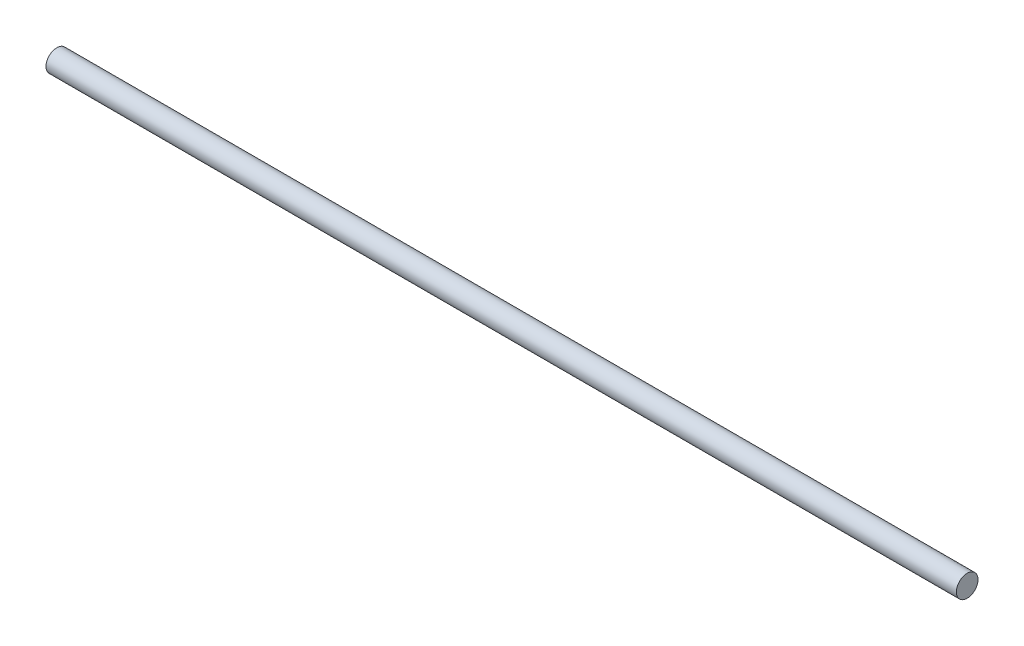
ISO-10303-21;
HEADER;
FILE_DESCRIPTION(('STEP AP214'),'2;1');
FILE_NAME('part.step','',(''),(''),'','','');
FILE_SCHEMA(('AUTOMOTIVE_DESIGN { 1 0 10303 214 1 1 1 1 }'));
ENDSEC;
DATA;
#1=APPLICATION_CONTEXT('core data for automotive mechanical design processes');
#2=APPLICATION_PROTOCOL_DEFINITION('international standard','automotive_design',2000,#1);
#3=PRODUCT_CONTEXT('',#1,'mechanical');
#4=PRODUCT('Part','Part','',(#3));
#5=PRODUCT_RELATED_PRODUCT_CATEGORY('part','',(#4));
#6=PRODUCT_DEFINITION_FORMATION('','',#4);
#7=PRODUCT_DEFINITION_CONTEXT('part definition',#1,'design');
#8=PRODUCT_DEFINITION('design','',#6,#7);
#9=PRODUCT_DEFINITION_SHAPE('','',#8);
#10=(LENGTH_UNIT() NAMED_UNIT(*) SI_UNIT(.MILLI.,.METRE.));
#11=(NAMED_UNIT(*) PLANE_ANGLE_UNIT() SI_UNIT($,.RADIAN.));
#12=(NAMED_UNIT(*) SI_UNIT($,.STERADIAN.) SOLID_ANGLE_UNIT());
#13=UNCERTAINTY_MEASURE_WITH_UNIT(LENGTH_MEASURE(1.E-05),#10,'distance_accuracy_value','');
#14=(GEOMETRIC_REPRESENTATION_CONTEXT(3) GLOBAL_UNCERTAINTY_ASSIGNED_CONTEXT((#13)) GLOBAL_UNIT_ASSIGNED_CONTEXT((#10,
#11,#12)) REPRESENTATION_CONTEXT('',''));
#15=CARTESIAN_POINT('',(0.,0.,0.));
#16=DIRECTION('',(0.,0.,1.));
#17=DIRECTION('',(1.,0.,0.));
#18=AXIS2_PLACEMENT_3D('',#15,#16,#17);
#19=CARTESIAN_POINT('',(191.750877523035,0.,0.));
#20=DIRECTION('',(-1.,0.,0.));
#21=DIRECTION('',(0.,0.,1.));
#22=AXIS2_PLACEMENT_3D('',#19,#20,#21);
#23=CYLINDRICAL_SURFACE('',#22,2.28600000000001);
#24=CARTESIAN_POINT('',(191.750877523035,0.,0.));
#25=DIRECTION('',(1.,0.,0.));
#26=DIRECTION('',(0.,0.,-1.));
#27=AXIS2_PLACEMENT_3D('',#24,#25,#26);
#28=CIRCLE('',#27,2.28600000000001);
#29=CARTESIAN_POINT('',(191.750877523035,0.,2.28600000000001));
#30=VERTEX_POINT('',#29);
#31=EDGE_CURVE('E10',#30,#30,#28,.T.);
#32=CARTESIAN_POINT('',(0.,0.,0.));
#33=DIRECTION('',(1.,0.,0.));
#34=DIRECTION('',(0.,0.,-1.));
#35=AXIS2_PLACEMENT_3D('',#32,#33,#34);
#36=CIRCLE('',#35,2.28600000000001);
#37=CARTESIAN_POINT('',(0.,0.,2.28600000000001));
#38=VERTEX_POINT('',#37);
#39=EDGE_CURVE('E46',#38,#38,#36,.T.);
#40=CARTESIAN_POINT('',(191.750877523035,0.,2.28600000000001));
#41=CARTESIAN_POINT('',(189.753472548837,0.,2.28600000000001));
#42=CARTESIAN_POINT('',(187.756067574638,0.,2.28600000000001));
#43=CARTESIAN_POINT('',(183.761257626242,0.,2.28600000000001));
#44=CARTESIAN_POINT('',(181.763852652043,0.,2.28600000000001));
#45=CARTESIAN_POINT('',(177.769042703647,0.,2.28600000000001));
#46=CARTESIAN_POINT('',(175.771637729449,0.,2.28600000000001));
#47=CARTESIAN_POINT('',(171.776827781052,0.,2.28600000000001));
#48=CARTESIAN_POINT('',(169.779422806854,0.,2.28600000000001));
#49=CARTESIAN_POINT('',(165.784612858457,0.,2.28600000000001));
#50=CARTESIAN_POINT('',(163.787207884259,0.,2.28600000000001));
#51=CARTESIAN_POINT('',(159.792397935862,0.,2.28600000000001));
#52=CARTESIAN_POINT('',(157.794992961664,0.,2.28600000000001));
#53=CARTESIAN_POINT('',(153.800183013268,0.,2.28600000000001));
#54=CARTESIAN_POINT('',(151.802778039069,0.,2.28600000000001));
#55=CARTESIAN_POINT('',(147.807968090673,0.,2.28600000000001));
#56=CARTESIAN_POINT('',(145.810563116474,0.,2.28600000000001));
#57=CARTESIAN_POINT('',(141.815753168078,0.,2.28600000000001));
#58=CARTESIAN_POINT('',(139.81834819388,0.,2.28600000000001));
#59=CARTESIAN_POINT('',(135.823538245483,0.,2.28600000000001));
#60=CARTESIAN_POINT('',(133.826133271285,0.,2.28600000000001));
#61=CARTESIAN_POINT('',(129.831323322888,0.,2.28600000000001));
#62=CARTESIAN_POINT('',(127.83391834869,0.,2.28600000000001));
#63=CARTESIAN_POINT('',(123.839108400293,0.,2.28600000000001));
#64=CARTESIAN_POINT('',(121.841703426095,0.,2.28600000000001));
#65=CARTESIAN_POINT('',(117.846893477699,0.,2.28600000000001));
#66=CARTESIAN_POINT('',(115.8494885035,0.,2.28600000000001));
#67=CARTESIAN_POINT('',(111.854678555104,0.,2.28600000000001));
#68=CARTESIAN_POINT('',(109.857273580905,0.,2.28600000000001));
#69=CARTESIAN_POINT('',(105.862463632509,0.,2.28600000000001));
#70=CARTESIAN_POINT('',(103.865058658311,0.,2.28600000000001));
#71=CARTESIAN_POINT('',(99.870248709914,0.,2.28600000000001));
#72=CARTESIAN_POINT('',(97.8728437357157,0.,2.28600000000001));
#73=CARTESIAN_POINT('',(93.8780337873191,0.,2.28600000000001));
#74=CARTESIAN_POINT('',(91.8806288131209,0.,2.28600000000001));
#75=CARTESIAN_POINT('',(87.8858188647243,0.,2.28600000000001));
#76=CARTESIAN_POINT('',(85.888413890526,0.,2.28600000000001));
#77=CARTESIAN_POINT('',(81.8936039421294,0.,2.28600000000001));
#78=CARTESIAN_POINT('',(79.8961989679312,0.,2.28600000000001));
#79=CARTESIAN_POINT('',(75.9013890195346,0.,2.28600000000001));
#80=CARTESIAN_POINT('',(73.9039840453363,0.,2.28600000000001));
#81=CARTESIAN_POINT('',(69.9091740969398,0.,2.28600000000001));
#82=CARTESIAN_POINT('',(67.9117691227415,0.,2.28600000000001));
#83=CARTESIAN_POINT('',(63.916959174345,0.,2.28600000000001));
#84=CARTESIAN_POINT('',(61.9195542001467,0.,2.28600000000001));
#85=CARTESIAN_POINT('',(57.9247442517501,0.,2.28600000000001));
#86=CARTESIAN_POINT('',(55.9273392775518,0.,2.28600000000001));
#87=CARTESIAN_POINT('',(51.9325293291553,0.,2.28600000000001));
#88=CARTESIAN_POINT('',(49.935124354957,0.,2.28600000000001));
#89=CARTESIAN_POINT('',(45.9403144065604,0.,2.28600000000001));
#90=CARTESIAN_POINT('',(43.9429094323621,0.,2.28600000000001));
#91=CARTESIAN_POINT('',(39.9480994839656,0.,2.28600000000001));
#92=CARTESIAN_POINT('',(37.9506945097673,0.,2.28600000000001));
#93=CARTESIAN_POINT('',(33.9558845613707,0.,2.28600000000001));
#94=CARTESIAN_POINT('',(31.9584795871725,0.,2.28600000000001));
#95=CARTESIAN_POINT('',(27.9636696387759,0.,2.28600000000001));
#96=CARTESIAN_POINT('',(25.9662646645776,0.,2.28600000000001));
#97=CARTESIAN_POINT('',(21.9714547161811,0.,2.28600000000001));
#98=CARTESIAN_POINT('',(19.9740497419828,0.,2.28600000000001));
#99=CARTESIAN_POINT('',(15.9792397935862,0.,2.28600000000001));
#100=CARTESIAN_POINT('',(13.9818348193879,0.,2.28600000000001));
#101=CARTESIAN_POINT('',(9.98702487099137,0.,2.28600000000001));
#102=CARTESIAN_POINT('',(7.98961989679309,0.,2.28600000000001));
#103=CARTESIAN_POINT('',(3.99480994839652,0.,2.28600000000001));
#104=CARTESIAN_POINT('',(1.99740497419825,0.,2.28600000000001));
#105=CARTESIAN_POINT('',(0.,0.,2.28600000000001));
#106=B_SPLINE_CURVE_WITH_KNOTS('',3,(#40,#41,#42,#43,#44,#45,#46,#47,#48,#49,#50,#51,#52,#53,
#54,#55,#56,#57,#58,#59,#60,#61,#62,#63,#64,#65,#66,#67,#68,#69,#70,#71,#72,#73,#74,#75,#76,#77,
#78,#79,#80,#81,#82,#83,#84,#85,#86,#87,#88,#89,#90,#91,#92,#93,#94,#95,#96,#97,#98,#99,#100,
#101,#102,#103,#104,#105),.UNSPECIFIED.,.F.,.F.,(4,2,2,2,2,2,2,2,2,2,2,2,2,2,2,2,2,2,2,2,2,2,2,
2,2,2,2,2,2,2,2,2,4),(0.,5.99221492259486,11.9844298451897,17.9766447677845,23.9688596903794,
29.9610746129742,35.9532895355691,41.9455044581639,47.9377193807588,53.9299343033536,
59.9221492259484,65.9143641485433,71.9065790711381,77.8987939937329,83.8910089163278,
89.8832238389226,95.8754387615175,101.867653684112,107.859868606707,113.852083529302,
119.844298451897,125.836513374492,131.828728297087,137.820943219681,143.813158142276,
149.805373064871,155.797587987466,161.789802910061,167.782017832656,173.77423275525,
179.766447677845,185.75866260044,191.750877523035),.UNSPECIFIED.);
#107=EDGE_CURVE('BSEAM43',#30,#38,#106,.T.);
#108=ORIENTED_EDGE('',*,*,#31,.F.);
#109=ORIENTED_EDGE('',*,*,#39,.T.);
#110=ORIENTED_EDGE('',*,*,#107,.T.);
#111=ORIENTED_EDGE('',*,*,#107,.F.);
#112=EDGE_LOOP('',(#108,#110,#109,#111));
#113=FACE_BOUND('',#112,.T.);
#114=ADVANCED_FACE('F43',(#113),#23,.T.);
#115=CARTESIAN_POINT('',(191.750877523035,0.,0.));
#116=DIRECTION('',(1.,0.,0.));
#117=DIRECTION('',(0.,0.,-1.));
#118=AXIS2_PLACEMENT_3D('',#115,#116,#117);
#119=PLANE('',#118);
#120=ORIENTED_EDGE('',*,*,#31,.T.);
#121=EDGE_LOOP('',(#120));
#122=FACE_BOUND('',#121,.T.);
#123=ADVANCED_FACE('F58',(#122),#119,.T.);
#124=CARTESIAN_POINT('',(0.,0.,0.));
#125=DIRECTION('',(1.,0.,0.));
#126=DIRECTION('',(0.,0.,-1.));
#127=AXIS2_PLACEMENT_3D('',#124,#125,#126);
#128=PLANE('',#127);
#129=ORIENTED_EDGE('',*,*,#39,.F.);
#130=EDGE_LOOP('',(#129));
#131=FACE_BOUND('',#130,.T.);
#132=ADVANCED_FACE('F56',(#131),#128,.F.);
#133=CLOSED_SHELL('',(#114,#123,#132));
#134=MANIFOLD_SOLID_BREP('B2',#133);
#135=ADVANCED_BREP_SHAPE_REPRESENTATION('',(#18,#134),#14);
#136=SHAPE_DEFINITION_REPRESENTATION(#9,#135);
ENDSEC;
END-ISO-10303-21;
